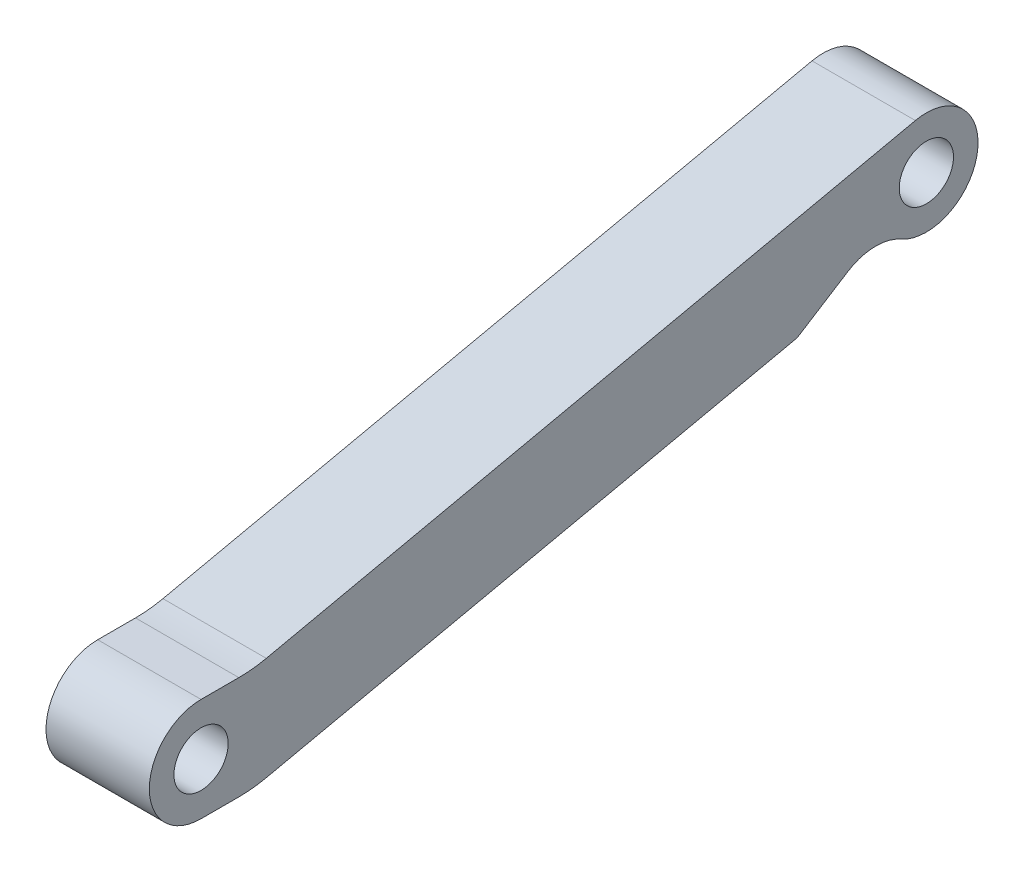
ISO-10303-21;
HEADER;
FILE_DESCRIPTION(('STEP AP214'),'2;1');
FILE_NAME('part.step','',(''),(''),'','','');
FILE_SCHEMA(('AUTOMOTIVE_DESIGN { 1 0 10303 214 1 1 1 1 }'));
ENDSEC;
DATA;
#1=APPLICATION_CONTEXT('core data for automotive mechanical design processes');
#2=APPLICATION_PROTOCOL_DEFINITION('international standard','automotive_design',2000,#1);
#3=PRODUCT_CONTEXT('',#1,'mechanical');
#4=PRODUCT('Part','Part','',(#3));
#5=PRODUCT_RELATED_PRODUCT_CATEGORY('part','',(#4));
#6=PRODUCT_DEFINITION_FORMATION('','',#4);
#7=PRODUCT_DEFINITION_CONTEXT('part definition',#1,'design');
#8=PRODUCT_DEFINITION('design','',#6,#7);
#9=PRODUCT_DEFINITION_SHAPE('','',#8);
#10=(LENGTH_UNIT() NAMED_UNIT(*) SI_UNIT(.MILLI.,.METRE.));
#11=(NAMED_UNIT(*) PLANE_ANGLE_UNIT() SI_UNIT($,.RADIAN.));
#12=(NAMED_UNIT(*) SI_UNIT($,.STERADIAN.) SOLID_ANGLE_UNIT());
#13=UNCERTAINTY_MEASURE_WITH_UNIT(LENGTH_MEASURE(1.E-05),#10,'distance_accuracy_value','');
#14=(GEOMETRIC_REPRESENTATION_CONTEXT(3) GLOBAL_UNCERTAINTY_ASSIGNED_CONTEXT((#13)) GLOBAL_UNIT_ASSIGNED_CONTEXT((#10,
#11,#12)) REPRESENTATION_CONTEXT('',''));
#15=CARTESIAN_POINT('',(0.,0.,0.));
#16=DIRECTION('',(0.,0.,1.));
#17=DIRECTION('',(1.,0.,0.));
#18=AXIS2_PLACEMENT_3D('',#15,#16,#17);
#19=CARTESIAN_POINT('',(-2.,-1.86176041113956,-75.3099594641836));
#20=DIRECTION('',(1.,0.,0.));
#21=DIRECTION('',(0.,0.,-1.));
#22=AXIS2_PLACEMENT_3D('',#19,#20,#21);
#23=CYLINDRICAL_SURFACE('',#22,1.99999999999998);
#24=DIRECTION('',(1.,0.,0.));
#25=VECTOR('',#24,1.);
#26=CARTESIAN_POINT('',(-2.,-0.118380205569797,-76.2900744874474));
#27=LINE('',#26,#25);
#28=CARTESIAN_POINT('',(-2.,-0.118380205569797,-76.2900744874474));
#29=VERTEX_POINT('',#28);
#30=CARTESIAN_POINT('',(2.,-0.118380205569797,-76.2900744874474));
#31=VERTEX_POINT('',#30);
#32=EDGE_CURVE('E43',#29,#31,#27,.T.);
#33=ORIENTED_EDGE('',*,*,#32,.T.);
#34=CARTESIAN_POINT('',(2.,-1.86176041113956,-75.3099594641836));
#35=DIRECTION('',(1.,0.,0.));
#36=DIRECTION('',(0.,0.,-1.));
#37=AXIS2_PLACEMENT_3D('',#34,#35,#36);
#38=CIRCLE('',#37,1.99999999999998);
#39=CARTESIAN_POINT('',(2.,-0.170765647105421,-74.2420003320024));
#40=VERTEX_POINT('',#39);
#41=EDGE_CURVE('E120',#31,#40,#38,.T.);
#42=ORIENTED_EDGE('',*,*,#41,.T.);
#43=DIRECTION('',(1.,0.,0.));
#44=VECTOR('',#43,1.);
#45=CARTESIAN_POINT('',(-2.,-0.170765647105421,-74.2420003320024));
#46=LINE('',#45,#44);
#47=CARTESIAN_POINT('',(-2.,-0.170765647105421,-74.2420003320024));
#48=VERTEX_POINT('',#47);
#49=EDGE_CURVE('E11',#48,#40,#46,.T.);
#50=ORIENTED_EDGE('',*,*,#49,.F.);
#51=CARTESIAN_POINT('',(-2.,-1.86176041113956,-75.3099594641836));
#52=DIRECTION('',(1.,0.,0.));
#53=DIRECTION('',(0.,0.,-1.));
#54=AXIS2_PLACEMENT_3D('',#51,#52,#53);
#55=CIRCLE('',#54,1.99999999999998);
#56=EDGE_CURVE('E56',#29,#48,#55,.T.);
#57=ORIENTED_EDGE('',*,*,#56,.F.);
#58=EDGE_LOOP('',(#33,#42,#50,#57));
#59=FACE_BOUND('',#58,.T.);
#60=ADVANCED_FACE('F39',(#59),#23,.F.);
#61=CARTESIAN_POINT('',(-2.,-33.6407284927772,-21.2460286520213));
#62=DIRECTION('',(0.,-0.845497382017076,-0.533979566090568));
#63=DIRECTION('',(0.,0.533979566090568,-0.845497382017076));
#64=AXIS2_PLACEMENT_3D('',#61,#62,#63);
#65=PLANE('',#64);
#66=ORIENTED_EDGE('',*,*,#49,.T.);
#67=DIRECTION('',(0.,0.533979566090568,-0.845497382017076));
#68=VECTOR('',#67,1.);
#69=CARTESIAN_POINT('',(2.,-33.6407284927772,-21.2460286520213));
#70=LINE('',#69,#68);
#71=CARTESIAN_POINT('',(2.,-1.4160760515609,-72.2701895107113));
#72=VERTEX_POINT('',#71);
#73=EDGE_CURVE('E137',#72,#40,#70,.T.);
#74=ORIENTED_EDGE('',*,*,#73,.F.);
#75=DIRECTION('',(1.,0.,0.));
#76=VECTOR('',#75,1.);
#77=CARTESIAN_POINT('',(-2.,-1.4160760515609,-72.2701895107113));
#78=LINE('',#77,#76);
#79=CARTESIAN_POINT('',(-2.,-1.4160760515609,-72.2701895107113));
#80=VERTEX_POINT('',#79);
#81=EDGE_CURVE('E48',#80,#72,#78,.T.);
#82=ORIENTED_EDGE('',*,*,#81,.F.);
#83=DIRECTION('',(0.,0.533979566090568,-0.845497382017076));
#84=VECTOR('',#83,1.);
#85=CARTESIAN_POINT('',(-2.,-33.6407284927772,-21.2460286520213));
#86=LINE('',#85,#84);
#87=EDGE_CURVE('E124',#80,#48,#86,.T.);
#88=ORIENTED_EDGE('',*,*,#87,.T.);
#89=EDGE_LOOP('',(#66,#74,#82,#88));
#90=FACE_BOUND('',#89,.T.);
#91=ADVANCED_FACE('F232',(#90),#65,.T.);
#92=CARTESIAN_POINT('',(-2.,-16.3654353439535,-3.56068301783768));
#93=DIRECTION('',(0.,-0.977139418502525,-0.21259952212681));
#94=DIRECTION('',(0.,0.21259952212681,-0.977139418502525));
#95=AXIS2_PLACEMENT_3D('',#92,#93,#94);
#96=PLANE('',#95);
#97=ORIENTED_EDGE('',*,*,#81,.T.);
#98=DIRECTION('',(0.,0.21259952212681,-0.977139418502525));
#99=VECTOR('',#98,1.);
#100=CARTESIAN_POINT('',(2.,-16.3654353439535,-3.56068301783768));
#101=LINE('',#100,#99);
#102=CARTESIAN_POINT('',(2.,-5.88569709251263,-51.7271381379186));
#103=VERTEX_POINT('',#102);
#104=EDGE_CURVE('E161',#103,#72,#101,.T.);
#105=ORIENTED_EDGE('',*,*,#104,.F.);
#106=DIRECTION('',(1.,0.,0.));
#107=VECTOR('',#106,1.);
#108=CARTESIAN_POINT('',(-2.,-5.88569709251263,-51.7271381379186));
#109=LINE('',#108,#107);
#110=CARTESIAN_POINT('',(-2.,-5.88569709251263,-51.7271381379186));
#111=VERTEX_POINT('',#110);
#112=EDGE_CURVE('E192',#111,#103,#109,.T.);
#113=ORIENTED_EDGE('',*,*,#112,.F.);
#114=DIRECTION('',(0.,0.21259952212681,-0.977139418502525));
#115=VECTOR('',#114,1.);
#116=CARTESIAN_POINT('',(-2.,-16.3654353439535,-3.56068301783768));
#117=LINE('',#116,#115);
#118=EDGE_CURVE('E188',#111,#80,#117,.T.);
#119=ORIENTED_EDGE('',*,*,#118,.T.);
#120=EDGE_LOOP('',(#97,#105,#113,#119));
#121=FACE_BOUND('',#120,.T.);
#122=ADVANCED_FACE('F230',(#121),#96,.T.);
#123=CARTESIAN_POINT('',(-2.,-1.00000000000001,-50.6641405272846));
#124=DIRECTION('',(1.,0.,0.));
#125=DIRECTION('',(0.,0.,-1.));
#126=AXIS2_PLACEMENT_3D('',#123,#124,#125);
#127=CYLINDRICAL_SURFACE('',#126,5.);
#128=ORIENTED_EDGE('',*,*,#112,.T.);
#129=CARTESIAN_POINT('',(2.,-1.00000000000001,-50.6641405272846));
#130=DIRECTION('',(1.,0.,0.));
#131=DIRECTION('',(0.,0.,-1.));
#132=AXIS2_PLACEMENT_3D('',#129,#130,#131);
#133=CIRCLE('',#132,5.);
#134=CARTESIAN_POINT('',(2.,-6.00000000000001,-50.6641405272846));
#135=VERTEX_POINT('',#134);
#136=EDGE_CURVE('E158',#135,#103,#133,.T.);
#137=ORIENTED_EDGE('',*,*,#136,.F.);
#138=DIRECTION('',(1.,0.,0.));
#139=VECTOR('',#138,1.);
#140=CARTESIAN_POINT('',(-2.,-6.00000000000001,-50.6641405272846));
#141=LINE('',#140,#139);
#142=CARTESIAN_POINT('',(-2.,-6.00000000000001,-50.6641405272846));
#143=VERTEX_POINT('',#142);
#144=EDGE_CURVE('E194',#143,#135,#141,.T.);
#145=ORIENTED_EDGE('',*,*,#144,.F.);
#146=CARTESIAN_POINT('',(-2.,-1.00000000000001,-50.6641405272846));
#147=DIRECTION('',(1.,0.,0.));
#148=DIRECTION('',(0.,0.,-1.));
#149=AXIS2_PLACEMENT_3D('',#146,#147,#148);
#150=CIRCLE('',#149,5.);
#151=EDGE_CURVE('E185',#143,#111,#150,.T.);
#152=ORIENTED_EDGE('',*,*,#151,.T.);
#153=EDGE_LOOP('',(#128,#137,#145,#152));
#154=FACE_BOUND('',#153,.T.);
#155=ADVANCED_FACE('F227',(#154),#127,.T.);
#156=CARTESIAN_POINT('',(-2.,-6.00000000000004,0.));
#157=DIRECTION('',(0.,-1.,0.));
#158=DIRECTION('',(0.,0.,-1.));
#159=AXIS2_PLACEMENT_3D('',#156,#157,#158);
#160=PLANE('',#159);
#161=ORIENTED_EDGE('',*,*,#144,.T.);
#162=DIRECTION('',(0.,0.,-1.));
#163=VECTOR('',#162,1.);
#164=CARTESIAN_POINT('',(2.,-6.00000000000004,0.));
#165=LINE('',#164,#163);
#166=CARTESIAN_POINT('',(2.,-6.00000000000001,-49.2017847625298));
#167=VERTEX_POINT('',#166);
#168=EDGE_CURVE('E155',#167,#135,#165,.T.);
#169=ORIENTED_EDGE('',*,*,#168,.F.);
#170=DIRECTION('',(1.,0.,0.));
#171=VECTOR('',#170,1.);
#172=CARTESIAN_POINT('',(-2.,-6.00000000000001,-49.2017847625298));
#173=LINE('',#172,#171);
#174=CARTESIAN_POINT('',(-2.,-6.00000000000001,-49.2017847625298));
#175=VERTEX_POINT('',#174);
#176=EDGE_CURVE('E196',#175,#167,#173,.T.);
#177=ORIENTED_EDGE('',*,*,#176,.F.);
#178=DIRECTION('',(0.,0.,-1.));
#179=VECTOR('',#178,1.);
#180=CARTESIAN_POINT('',(-2.,-6.00000000000004,0.));
#181=LINE('',#180,#179);
#182=EDGE_CURVE('E182',#175,#143,#181,.T.);
#183=ORIENTED_EDGE('',*,*,#182,.T.);
#184=EDGE_LOOP('',(#161,#169,#177,#183));
#185=FACE_BOUND('',#184,.T.);
#186=ADVANCED_FACE('F223',(#185),#160,.T.);
#187=CARTESIAN_POINT('',(-2.,-4.00000000000001,-49.2017847625298));
#188=DIRECTION('',(1.,0.,0.));
#189=DIRECTION('',(0.,0.,-1.));
#190=AXIS2_PLACEMENT_3D('',#187,#188,#189);
#191=CYLINDRICAL_SURFACE('',#190,2.);
#192=ORIENTED_EDGE('',*,*,#176,.T.);
#193=CARTESIAN_POINT('',(2.,-4.00000000000001,-49.2017847625298));
#194=DIRECTION('',(1.,0.,0.));
#195=DIRECTION('',(0.,0.,-1.));
#196=AXIS2_PLACEMENT_3D('',#193,#194,#195);
#197=CIRCLE('',#196,2.);
#198=CARTESIAN_POINT('',(2.,-2.00000000000001,-49.2017847625298));
#199=VERTEX_POINT('',#198);
#200=EDGE_CURVE('E152',#199,#167,#197,.T.);
#201=ORIENTED_EDGE('',*,*,#200,.F.);
#202=DIRECTION('',(1.,0.,0.));
#203=VECTOR('',#202,1.);
#204=CARTESIAN_POINT('',(-2.,-2.00000000000001,-49.2017847625298));
#205=LINE('',#204,#203);
#206=CARTESIAN_POINT('',(-2.,-2.00000000000001,-49.2017847625298));
#207=VERTEX_POINT('',#206);
#208=EDGE_CURVE('E198',#207,#199,#205,.T.);
#209=ORIENTED_EDGE('',*,*,#208,.F.);
#210=CARTESIAN_POINT('',(-2.,-4.00000000000001,-49.2017847625298));
#211=DIRECTION('',(1.,0.,0.));
#212=DIRECTION('',(0.,0.,-1.));
#213=AXIS2_PLACEMENT_3D('',#210,#211,#212);
#214=CIRCLE('',#213,2.);
#215=EDGE_CURVE('E179',#207,#175,#214,.T.);
#216=ORIENTED_EDGE('',*,*,#215,.T.);
#217=EDGE_LOOP('',(#192,#201,#209,#216));
#218=FACE_BOUND('',#217,.T.);
#219=ADVANCED_FACE('F220',(#218),#191,.T.);
#220=CARTESIAN_POINT('',(-2.,-2.00000000000004,0.));
#221=DIRECTION('',(0.,-1.,0.));
#222=DIRECTION('',(0.,0.,-1.));
#223=AXIS2_PLACEMENT_3D('',#220,#221,#222);
#224=PLANE('',#223);
#225=ORIENTED_EDGE('',*,*,#208,.T.);
#226=DIRECTION('',(0.,0.,-1.));
#227=VECTOR('',#226,1.);
#228=CARTESIAN_POINT('',(2.,-2.00000000000004,0.));
#229=LINE('',#228,#227);
#230=CARTESIAN_POINT('',(2.,-2.00000000000001,-50.6641405272846));
#231=VERTEX_POINT('',#230);
#232=EDGE_CURVE('E149',#199,#231,#229,.T.);
#233=ORIENTED_EDGE('',*,*,#232,.T.);
#234=DIRECTION('',(1.,0.,0.));
#235=VECTOR('',#234,1.);
#236=CARTESIAN_POINT('',(-2.,-2.00000000000001,-50.6641405272846));
#237=LINE('',#236,#235);
#238=CARTESIAN_POINT('',(-2.,-2.00000000000001,-50.6641405272846));
#239=VERTEX_POINT('',#238);
#240=EDGE_CURVE('E200',#239,#231,#237,.T.);
#241=ORIENTED_EDGE('',*,*,#240,.F.);
#242=DIRECTION('',(0.,0.,-1.));
#243=VECTOR('',#242,1.);
#244=CARTESIAN_POINT('',(-2.,-2.00000000000004,0.));
#245=LINE('',#244,#243);
#246=EDGE_CURVE('E177',#207,#239,#245,.T.);
#247=ORIENTED_EDGE('',*,*,#246,.F.);
#248=EDGE_LOOP('',(#225,#233,#241,#247));
#249=FACE_BOUND('',#248,.T.);
#250=ADVANCED_FACE('F215',(#249),#224,.F.);
#251=CARTESIAN_POINT('',(-2.,2.99999999999999,-50.6641405272846));
#252=DIRECTION('',(1.,0.,0.));
#253=DIRECTION('',(0.,0.,-1.));
#254=AXIS2_PLACEMENT_3D('',#251,#252,#253);
#255=CYLINDRICAL_SURFACE('',#254,5.);
#256=ORIENTED_EDGE('',*,*,#240,.T.);
#257=CARTESIAN_POINT('',(2.,2.99999999999999,-50.6641405272846));
#258=DIRECTION('',(1.,0.,0.));
#259=DIRECTION('',(0.,0.,-1.));
#260=AXIS2_PLACEMENT_3D('',#257,#258,#259);
#261=CIRCLE('',#260,5.);
#262=CARTESIAN_POINT('',(2.,-1.88569709251263,-51.7271381379186));
#263=VERTEX_POINT('',#262);
#264=EDGE_CURVE('E146',#231,#263,#261,.T.);
#265=ORIENTED_EDGE('',*,*,#264,.T.);
#266=DIRECTION('',(1.,0.,0.));
#267=VECTOR('',#266,1.);
#268=CARTESIAN_POINT('',(-2.,-1.88569709251263,-51.7271381379186));
#269=LINE('',#268,#267);
#270=CARTESIAN_POINT('',(-2.,-1.88569709251263,-51.7271381379186));
#271=VERTEX_POINT('',#270);
#272=EDGE_CURVE('E202',#271,#263,#269,.T.);
#273=ORIENTED_EDGE('',*,*,#272,.F.);
#274=CARTESIAN_POINT('',(-2.,2.99999999999999,-50.6641405272846));
#275=DIRECTION('',(1.,0.,0.));
#276=DIRECTION('',(0.,0.,-1.));
#277=AXIS2_PLACEMENT_3D('',#274,#275,#276);
#278=CIRCLE('',#277,5.);
#279=EDGE_CURVE('E175',#239,#271,#278,.T.);
#280=ORIENTED_EDGE('',*,*,#279,.F.);
#281=EDGE_LOOP('',(#256,#265,#273,#280));
#282=FACE_BOUND('',#281,.T.);
#283=ADVANCED_FACE('F211',(#282),#255,.F.);
#284=CARTESIAN_POINT('',(-2.,-12.5462295711878,-2.72972552413807));
#285=DIRECTION('',(0.,-0.977139418502525,-0.21259952212681));
#286=DIRECTION('',(0.,0.21259952212681,-0.977139418502525));
#287=AXIS2_PLACEMENT_3D('',#284,#285,#286);
#288=PLANE('',#287);
#289=ORIENTED_EDGE('',*,*,#272,.T.);
#290=DIRECTION('',(0.,0.21259952212681,-0.977139418502525));
#291=VECTOR('',#290,1.);
#292=CARTESIAN_POINT('',(2.,-12.5462295711878,-2.72972552413807));
#293=LINE('',#292,#291);
#294=CARTESIAN_POINT('',(2.,3.57927883700504,-76.8449904664577));
#295=VERTEX_POINT('',#294);
#296=EDGE_CURVE('E132',#263,#295,#293,.T.);
#297=ORIENTED_EDGE('',*,*,#296,.T.);
#298=DIRECTION('',(1.,0.,0.));
#299=VECTOR('',#298,1.);
#300=CARTESIAN_POINT('',(-2.,3.57927883700504,-76.8449904664577));
#301=LINE('',#300,#299);
#302=CARTESIAN_POINT('',(-2.,3.57927883700504,-76.8449904664577));
#303=VERTEX_POINT('',#302);
#304=EDGE_CURVE('E123',#303,#295,#301,.T.);
#305=ORIENTED_EDGE('',*,*,#304,.F.);
#306=DIRECTION('',(0.,0.21259952212681,-0.977139418502525));
#307=VECTOR('',#306,1.);
#308=CARTESIAN_POINT('',(-2.,-12.5462295711878,-2.72972552413807));
#309=LINE('',#308,#307);
#310=EDGE_CURVE('E173',#271,#303,#309,.T.);
#311=ORIENTED_EDGE('',*,*,#310,.F.);
#312=EDGE_LOOP('',(#289,#297,#305,#311));
#313=FACE_BOUND('',#312,.T.);
#314=ADVANCED_FACE('F206',(#313),#288,.F.);
#315=CARTESIAN_POINT('',(-2.,1.62499999999998,-77.2701895107113));
#316=DIRECTION('',(1.,0.,0.));
#317=DIRECTION('',(0.,0.,-1.));
#318=AXIS2_PLACEMENT_3D('',#315,#316,#317);
#319=CYLINDRICAL_SURFACE('',#318,1.04999999999999);
#320=CARTESIAN_POINT('',(-2.,1.62499999999998,-77.2701895107113));
#321=DIRECTION('',(1.,0.,0.));
#322=DIRECTION('',(0.,0.,-1.));
#323=AXIS2_PLACEMENT_3D('',#320,#321,#322);
#324=CIRCLE('',#323,1.04999999999999);
#325=CARTESIAN_POINT('',(-2.,1.62499999999998,-78.3201895107113));
#326=VERTEX_POINT('',#325);
#327=EDGE_CURVE('E167',#326,#326,#324,.T.);
#328=ORIENTED_EDGE('',*,*,#327,.F.);
#329=EDGE_LOOP('',(#328));
#330=FACE_BOUND('',#329,.T.);
#331=CARTESIAN_POINT('',(2.,1.62499999999998,-77.2701895107113));
#332=DIRECTION('',(1.,0.,0.));
#333=DIRECTION('',(0.,0.,-1.));
#334=AXIS2_PLACEMENT_3D('',#331,#332,#333);
#335=CIRCLE('',#334,1.04999999999999);
#336=CARTESIAN_POINT('',(2.,1.62499999999998,-78.3201895107113));
#337=VERTEX_POINT('',#336);
#338=EDGE_CURVE('E138',#337,#337,#335,.T.);
#339=ORIENTED_EDGE('',*,*,#338,.T.);
#340=EDGE_LOOP('',(#339));
#341=FACE_BOUND('',#340,.T.);
#342=ADVANCED_FACE('F252',(#330,#341),#319,.F.);
#343=CARTESIAN_POINT('',(-2.,-4.00000000000001,-49.2017847625298));
#344=DIRECTION('',(1.,0.,0.));
#345=DIRECTION('',(0.,0.,-1.));
#346=AXIS2_PLACEMENT_3D('',#343,#344,#345);
#347=CYLINDRICAL_SURFACE('',#346,1.05);
#348=CARTESIAN_POINT('',(-2.,-4.00000000000001,-49.2017847625298));
#349=DIRECTION('',(1.,0.,0.));
#350=DIRECTION('',(0.,0.,-1.));
#351=AXIS2_PLACEMENT_3D('',#348,#349,#350);
#352=CIRCLE('',#351,1.05);
#353=CARTESIAN_POINT('',(-2.,-4.00000000000001,-50.2517847625298));
#354=VERTEX_POINT('',#353);
#355=EDGE_CURVE('E164',#354,#354,#352,.T.);
#356=ORIENTED_EDGE('',*,*,#355,.F.);
#357=EDGE_LOOP('',(#356));
#358=FACE_BOUND('',#357,.T.);
#359=CARTESIAN_POINT('',(2.,-4.00000000000001,-49.2017847625298));
#360=DIRECTION('',(1.,0.,0.));
#361=DIRECTION('',(0.,0.,-1.));
#362=AXIS2_PLACEMENT_3D('',#359,#360,#361);
#363=CIRCLE('',#362,1.05);
#364=CARTESIAN_POINT('',(2.,-4.00000000000001,-50.2517847625298));
#365=VERTEX_POINT('',#364);
#366=EDGE_CURVE('E141',#365,#365,#363,.T.);
#367=ORIENTED_EDGE('',*,*,#366,.T.);
#368=EDGE_LOOP('',(#367));
#369=FACE_BOUND('',#368,.T.);
#370=ADVANCED_FACE('F41',(#358,#369),#347,.F.);
#371=CARTESIAN_POINT('',(-2.,1.62499999999998,-77.2701895107113));
#372=DIRECTION('',(1.,0.,0.));
#373=DIRECTION('',(0.,0.,-1.));
#374=AXIS2_PLACEMENT_3D('',#371,#372,#373);
#375=CYLINDRICAL_SURFACE('',#374,2.00000000000002);
#376=ORIENTED_EDGE('',*,*,#304,.T.);
#377=CARTESIAN_POINT('',(2.,1.62499999999998,-77.2701895107113));
#378=DIRECTION('',(1.,0.,0.));
#379=DIRECTION('',(0.,0.,-1.));
#380=AXIS2_PLACEMENT_3D('',#377,#378,#379);
#381=CIRCLE('',#380,2.00000000000002);
#382=EDGE_CURVE('E126',#31,#295,#381,.T.);
#383=ORIENTED_EDGE('',*,*,#382,.F.);
#384=ORIENTED_EDGE('',*,*,#32,.F.);
#385=CARTESIAN_POINT('',(-2.,1.62499999999998,-77.2701895107113));
#386=DIRECTION('',(1.,0.,0.));
#387=DIRECTION('',(0.,0.,-1.));
#388=AXIS2_PLACEMENT_3D('',#385,#386,#387);
#389=CIRCLE('',#388,2.00000000000002);
#390=EDGE_CURVE('E171',#29,#303,#389,.T.);
#391=ORIENTED_EDGE('',*,*,#390,.T.);
#392=EDGE_LOOP('',(#376,#383,#384,#391));
#393=FACE_BOUND('',#392,.T.);
#394=ADVANCED_FACE('F127',(#393),#375,.T.);
#395=CARTESIAN_POINT('',(-2.,0.,0.));
#396=DIRECTION('',(1.,0.,0.));
#397=DIRECTION('',(0.,0.,-1.));
#398=AXIS2_PLACEMENT_3D('',#395,#396,#397);
#399=PLANE('',#398);
#400=ORIENTED_EDGE('',*,*,#355,.T.);
#401=EDGE_LOOP('',(#400));
#402=FACE_BOUND('',#401,.T.);
#403=ORIENTED_EDGE('',*,*,#327,.T.);
#404=EDGE_LOOP('',(#403));
#405=FACE_BOUND('',#404,.T.);
#406=ORIENTED_EDGE('',*,*,#56,.T.);
#407=ORIENTED_EDGE('',*,*,#87,.F.);
#408=ORIENTED_EDGE('',*,*,#118,.F.);
#409=ORIENTED_EDGE('',*,*,#151,.F.);
#410=ORIENTED_EDGE('',*,*,#182,.F.);
#411=ORIENTED_EDGE('',*,*,#215,.F.);
#412=ORIENTED_EDGE('',*,*,#246,.T.);
#413=ORIENTED_EDGE('',*,*,#279,.T.);
#414=ORIENTED_EDGE('',*,*,#310,.T.);
#415=ORIENTED_EDGE('',*,*,#390,.F.);
#416=EDGE_LOOP('',(#406,#407,#408,#409,#410,#411,#412,#413,#414,#415));
#417=FACE_BOUND('',#416,.T.);
#418=ADVANCED_FACE('F233',(#402,#405,#417),#399,.F.);
#419=CARTESIAN_POINT('',(2.,0.,0.));
#420=DIRECTION('',(1.,0.,0.));
#421=DIRECTION('',(0.,0.,-1.));
#422=AXIS2_PLACEMENT_3D('',#419,#420,#421);
#423=PLANE('',#422);
#424=ORIENTED_EDGE('',*,*,#366,.F.);
#425=EDGE_LOOP('',(#424));
#426=FACE_BOUND('',#425,.T.);
#427=ORIENTED_EDGE('',*,*,#338,.F.);
#428=EDGE_LOOP('',(#427));
#429=FACE_BOUND('',#428,.T.);
#430=ORIENTED_EDGE('',*,*,#41,.F.);
#431=ORIENTED_EDGE('',*,*,#382,.T.);
#432=ORIENTED_EDGE('',*,*,#296,.F.);
#433=ORIENTED_EDGE('',*,*,#264,.F.);
#434=ORIENTED_EDGE('',*,*,#232,.F.);
#435=ORIENTED_EDGE('',*,*,#200,.T.);
#436=ORIENTED_EDGE('',*,*,#168,.T.);
#437=ORIENTED_EDGE('',*,*,#136,.T.);
#438=ORIENTED_EDGE('',*,*,#104,.T.);
#439=ORIENTED_EDGE('',*,*,#73,.T.);
#440=EDGE_LOOP('',(#430,#431,#432,#433,#434,#435,#436,#437,#438,#439));
#441=FACE_BOUND('',#440,.T.);
#442=ADVANCED_FACE('F135',(#426,#429,#441),#423,.T.);
#443=CLOSED_SHELL('',(#60,#91,#122,#155,#186,#219,#250,#283,#314,#342,#370,#394,#418,#442));
#444=MANIFOLD_SOLID_BREP('B2',#443);
#445=ADVANCED_BREP_SHAPE_REPRESENTATION('',(#18,#444),#14);
#446=SHAPE_DEFINITION_REPRESENTATION(#9,#445);
ENDSEC;
END-ISO-10303-21;
